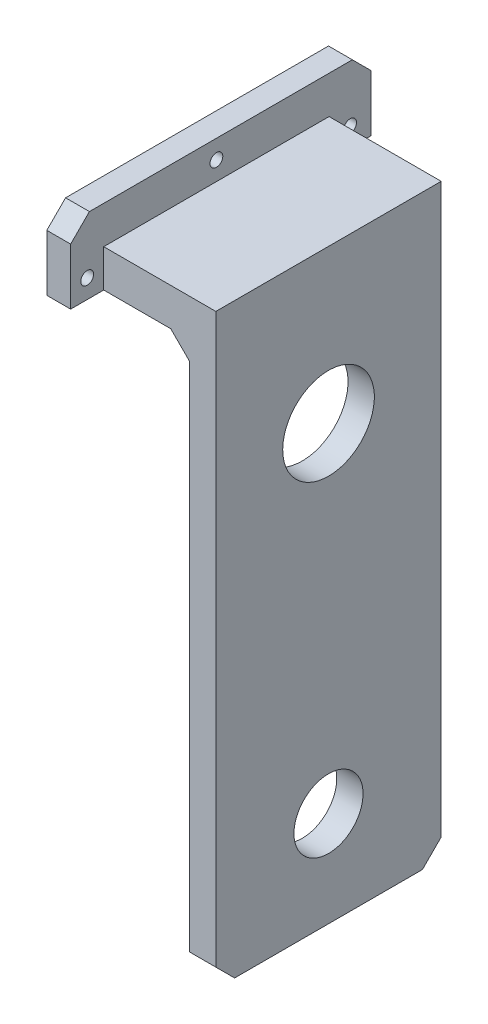
ISO-10303-21;
HEADER;
FILE_DESCRIPTION(('STEP AP214'),'2;1');
FILE_NAME('part.step','',(''),(''),'','','');
FILE_SCHEMA(('AUTOMOTIVE_DESIGN { 1 0 10303 214 1 1 1 1 }'));
ENDSEC;
DATA;
#1=APPLICATION_CONTEXT('core data for automotive mechanical design processes');
#2=APPLICATION_PROTOCOL_DEFINITION('international standard','automotive_design',2000,#1);
#3=PRODUCT_CONTEXT('',#1,'mechanical');
#4=PRODUCT('Part','Part','',(#3));
#5=PRODUCT_RELATED_PRODUCT_CATEGORY('part','',(#4));
#6=PRODUCT_DEFINITION_FORMATION('','',#4);
#7=PRODUCT_DEFINITION_CONTEXT('part definition',#1,'design');
#8=PRODUCT_DEFINITION('design','',#6,#7);
#9=PRODUCT_DEFINITION_SHAPE('','',#8);
#10=(LENGTH_UNIT() NAMED_UNIT(*) SI_UNIT(.MILLI.,.METRE.));
#11=(NAMED_UNIT(*) PLANE_ANGLE_UNIT() SI_UNIT($,.RADIAN.));
#12=(NAMED_UNIT(*) SI_UNIT($,.STERADIAN.) SOLID_ANGLE_UNIT());
#13=UNCERTAINTY_MEASURE_WITH_UNIT(LENGTH_MEASURE(1.E-05),#10,'distance_accuracy_value','');
#14=(GEOMETRIC_REPRESENTATION_CONTEXT(3) GLOBAL_UNCERTAINTY_ASSIGNED_CONTEXT((#13)) GLOBAL_UNIT_ASSIGNED_CONTEXT((#10,
#11,#12)) REPRESENTATION_CONTEXT('',''));
#15=CARTESIAN_POINT('',(0.,0.,0.));
#16=DIRECTION('',(0.,0.,1.));
#17=DIRECTION('',(1.,0.,0.));
#18=AXIS2_PLACEMENT_3D('',#15,#16,#17);
#19=CARTESIAN_POINT('',(18.1,-2.5,-15.));
#20=DIRECTION('',(0.,1.,0.));
#21=DIRECTION('',(0.,0.,-1.));
#22=AXIS2_PLACEMENT_3D('',#19,#20,#21);
#23=PLANE('',#22);
#24=DIRECTION('',(-1.,0.,0.));
#25=VECTOR('',#24,1.);
#26=CARTESIAN_POINT('',(18.1,-2.5,15.));
#27=LINE('',#26,#25);
#28=CARTESIAN_POINT('',(12.1,-2.5,15.));
#29=VERTEX_POINT('',#28);
#30=CARTESIAN_POINT('',(3.175,-2.5,15.));
#31=VERTEX_POINT('',#30);
#32=EDGE_CURVE('E179',#29,#31,#27,.T.);
#33=ORIENTED_EDGE('',*,*,#32,.T.);
#34=DIRECTION('',(0.,0.,-1.));
#35=VECTOR('',#34,1.);
#36=CARTESIAN_POINT('',(3.175,-2.5,19.402609778092));
#37=LINE('',#36,#35);
#38=CARTESIAN_POINT('',(3.175,-2.5,19.402609778092));
#39=VERTEX_POINT('',#38);
#40=EDGE_CURVE('E157',#39,#31,#37,.T.);
#41=ORIENTED_EDGE('',*,*,#40,.F.);
#42=DIRECTION('',(-1.,0.,0.));
#43=VECTOR('',#42,1.);
#44=CARTESIAN_POINT('',(3.175,-2.5,19.402609778092));
#45=LINE('',#44,#43);
#46=CARTESIAN_POINT('',(0.,-2.5,19.402609778092));
#47=VERTEX_POINT('',#46);
#48=EDGE_CURVE('E167',#39,#47,#45,.T.);
#49=ORIENTED_EDGE('',*,*,#48,.T.);
#50=DIRECTION('',(0.,0.,1.));
#51=VECTOR('',#50,1.);
#52=CARTESIAN_POINT('',(0.,-2.5,-15.));
#53=LINE('',#52,#51);
#54=CARTESIAN_POINT('',(0.,-2.5,-20.597390221908));
#55=VERTEX_POINT('',#54);
#56=EDGE_CURVE('E202',#55,#47,#53,.T.);
#57=ORIENTED_EDGE('',*,*,#56,.F.);
#58=DIRECTION('',(-1.,0.,0.));
#59=VECTOR('',#58,1.);
#60=CARTESIAN_POINT('',(3.175,-2.5,-20.597390221908));
#61=LINE('',#60,#59);
#62=CARTESIAN_POINT('',(3.175,-2.5,-20.597390221908));
#63=VERTEX_POINT('',#62);
#64=EDGE_CURVE('E174',#63,#55,#61,.T.);
#65=ORIENTED_EDGE('',*,*,#64,.F.);
#66=CARTESIAN_POINT('',(3.175,-2.5,-15.));
#67=VERTEX_POINT('',#66);
#68=EDGE_CURVE('E163',#67,#63,#37,.T.);
#69=ORIENTED_EDGE('',*,*,#68,.F.);
#70=DIRECTION('',(-1.,0.,0.));
#71=VECTOR('',#70,1.);
#72=CARTESIAN_POINT('',(18.1,-2.5,-15.));
#73=LINE('',#72,#71);
#74=CARTESIAN_POINT('',(12.1,-2.5,-15.));
#75=VERTEX_POINT('',#74);
#76=EDGE_CURVE('E219',#75,#67,#73,.T.);
#77=ORIENTED_EDGE('',*,*,#76,.F.);
#78=DIRECTION('',(0.,0.,-1.));
#79=VECTOR('',#78,1.);
#80=CARTESIAN_POINT('',(12.1,-2.5,-15.));
#81=LINE('',#80,#79);
#82=EDGE_CURVE('E226',#29,#75,#81,.T.);
#83=ORIENTED_EDGE('',*,*,#82,.F.);
#84=EDGE_LOOP('',(#33,#41,#49,#57,#65,#69,#77,#83));
#85=FACE_BOUND('',#84,.T.);
#86=ADVANCED_FACE('F43',(#85),#23,.F.);
#87=CARTESIAN_POINT('',(18.1,2.5,-15.));
#88=DIRECTION('',(0.,0.,1.));
#89=DIRECTION('',(-1.,0.,0.));
#90=AXIS2_PLACEMENT_3D('',#87,#88,#89);
#91=PLANE('',#90);
#92=DIRECTION('',(0.,1.,0.));
#93=VECTOR('',#92,1.);
#94=CARTESIAN_POINT('',(14.6,-75.6,-15.));
#95=LINE('',#94,#93);
#96=CARTESIAN_POINT('',(14.6,-73.1,-15.));
#97=VERTEX_POINT('',#96);
#98=CARTESIAN_POINT('',(14.6,-5.,-15.));
#99=VERTEX_POINT('',#98);
#100=EDGE_CURVE('E276',#97,#99,#95,.T.);
#101=ORIENTED_EDGE('',*,*,#100,.T.);
#102=DIRECTION('',(-0.707106781186545,0.70710678118655,0.));
#103=VECTOR('',#102,1.);
#104=CARTESIAN_POINT('',(12.6,-2.99999999999998,-15.));
#105=LINE('',#104,#103);
#106=EDGE_CURVE('E231',#75,#99,#105,.F.);
#107=ORIENTED_EDGE('',*,*,#106,.F.);
#108=ORIENTED_EDGE('',*,*,#76,.T.);
#109=DIRECTION('',(0.,1.,0.));
#110=VECTOR('',#109,1.);
#111=CARTESIAN_POINT('',(3.175,2.5,-15.));
#112=LINE('',#111,#110);
#113=CARTESIAN_POINT('',(3.175,2.5,-15.));
#114=VERTEX_POINT('',#113);
#115=EDGE_CURVE('E199',#67,#114,#112,.T.);
#116=ORIENTED_EDGE('',*,*,#115,.T.);
#117=DIRECTION('',(-1.,0.,0.));
#118=VECTOR('',#117,1.);
#119=CARTESIAN_POINT('',(18.1,2.5,-15.));
#120=LINE('',#119,#118);
#121=CARTESIAN_POINT('',(18.1,2.5,-15.));
#122=VERTEX_POINT('',#121);
#123=EDGE_CURVE('E211',#122,#114,#120,.T.);
#124=ORIENTED_EDGE('',*,*,#123,.F.);
#125=DIRECTION('',(0.,-1.,0.));
#126=VECTOR('',#125,1.);
#127=CARTESIAN_POINT('',(18.1,2.5,-15.));
#128=LINE('',#127,#126);
#129=CARTESIAN_POINT('',(18.1,-73.1,-15.));
#130=VERTEX_POINT('',#129);
#131=EDGE_CURVE('E203',#122,#130,#128,.T.);
#132=ORIENTED_EDGE('',*,*,#131,.T.);
#133=DIRECTION('',(1.,0.,0.));
#134=VECTOR('',#133,1.);
#135=CARTESIAN_POINT('',(18.1,-73.1,-15.));
#136=LINE('',#135,#134);
#137=EDGE_CURVE('E11',#97,#130,#136,.T.);
#138=ORIENTED_EDGE('',*,*,#137,.F.);
#139=EDGE_LOOP('',(#101,#107,#108,#116,#124,#132,#138));
#140=FACE_BOUND('',#139,.T.);
#141=ADVANCED_FACE('F323',(#140),#91,.F.);
#142=CARTESIAN_POINT('',(18.1,2.5,15.));
#143=DIRECTION('',(0.,0.,-1.));
#144=DIRECTION('',(1.,0.,0.));
#145=AXIS2_PLACEMENT_3D('',#142,#143,#144);
#146=PLANE('',#145);
#147=DIRECTION('',(0.,1.,0.));
#148=VECTOR('',#147,1.);
#149=CARTESIAN_POINT('',(18.1,2.5,15.));
#150=LINE('',#149,#148);
#151=CARTESIAN_POINT('',(18.1,-73.1,15.));
#152=VERTEX_POINT('',#151);
#153=CARTESIAN_POINT('',(18.1,2.5,15.));
#154=VERTEX_POINT('',#153);
#155=EDGE_CURVE('E206',#152,#154,#150,.T.);
#156=ORIENTED_EDGE('',*,*,#155,.T.);
#157=DIRECTION('',(-1.,0.,0.));
#158=VECTOR('',#157,1.);
#159=CARTESIAN_POINT('',(18.1,2.5,15.));
#160=LINE('',#159,#158);
#161=CARTESIAN_POINT('',(3.175,2.5,15.));
#162=VERTEX_POINT('',#161);
#163=EDGE_CURVE('E215',#154,#162,#160,.T.);
#164=ORIENTED_EDGE('',*,*,#163,.T.);
#165=DIRECTION('',(0.,-1.,0.));
#166=VECTOR('',#165,1.);
#167=CARTESIAN_POINT('',(3.175,2.5,15.));
#168=LINE('',#167,#166);
#169=EDGE_CURVE('E196',#162,#31,#168,.T.);
#170=ORIENTED_EDGE('',*,*,#169,.T.);
#171=ORIENTED_EDGE('',*,*,#32,.F.);
#172=DIRECTION('',(0.707106781186545,-0.70710678118655,0.));
#173=VECTOR('',#172,1.);
#174=CARTESIAN_POINT('',(12.6,-2.99999999999998,15.));
#175=LINE('',#174,#173);
#176=CARTESIAN_POINT('',(14.6,-5.,15.));
#177=VERTEX_POINT('',#176);
#178=EDGE_CURVE('E229',#177,#29,#175,.F.);
#179=ORIENTED_EDGE('',*,*,#178,.F.);
#180=DIRECTION('',(0.,1.,0.));
#181=VECTOR('',#180,1.);
#182=CARTESIAN_POINT('',(14.6,-75.6,15.));
#183=LINE('',#182,#181);
#184=CARTESIAN_POINT('',(14.6,-73.1,15.));
#185=VERTEX_POINT('',#184);
#186=EDGE_CURVE('E273',#185,#177,#183,.T.);
#187=ORIENTED_EDGE('',*,*,#186,.F.);
#188=DIRECTION('',(-1.,0.,0.));
#189=VECTOR('',#188,1.);
#190=CARTESIAN_POINT('',(18.1,-73.1,15.));
#191=LINE('',#190,#189);
#192=EDGE_CURVE('E261',#152,#185,#191,.T.);
#193=ORIENTED_EDGE('',*,*,#192,.F.);
#194=EDGE_LOOP('',(#156,#164,#170,#171,#179,#187,#193));
#195=FACE_BOUND('',#194,.T.);
#196=ADVANCED_FACE('F328',(#195),#146,.F.);
#197=CARTESIAN_POINT('',(18.1,2.5,-15.));
#198=DIRECTION('',(0.,-1.,0.));
#199=DIRECTION('',(0.,0.,1.));
#200=AXIS2_PLACEMENT_3D('',#197,#198,#199);
#201=PLANE('',#200);
#202=DIRECTION('',(0.,0.,1.));
#203=VECTOR('',#202,1.);
#204=CARTESIAN_POINT('',(3.175,2.5,-15.));
#205=LINE('',#204,#203);
#206=EDGE_CURVE('E222',#114,#162,#205,.T.);
#207=ORIENTED_EDGE('',*,*,#206,.T.);
#208=ORIENTED_EDGE('',*,*,#163,.F.);
#209=DIRECTION('',(0.,0.,-1.));
#210=VECTOR('',#209,1.);
#211=CARTESIAN_POINT('',(18.1,2.5,-15.));
#212=LINE('',#211,#210);
#213=EDGE_CURVE('E209',#154,#122,#212,.T.);
#214=ORIENTED_EDGE('',*,*,#213,.T.);
#215=ORIENTED_EDGE('',*,*,#123,.T.);
#216=EDGE_LOOP('',(#207,#208,#214,#215));
#217=FACE_BOUND('',#216,.T.);
#218=ADVANCED_FACE('F385',(#217),#201,.F.);
#219=CARTESIAN_POINT('',(18.1,0.,0.));
#220=DIRECTION('',(1.,0.,0.));
#221=DIRECTION('',(0.,0.,1.));
#222=AXIS2_PLACEMENT_3D('',#219,#220,#221);
#223=PLANE('',#222);
#224=CARTESIAN_POINT('',(18.1,-17.9000000000868,2.03531101694576E-06));
#225=DIRECTION('',(-1.,0.,0.));
#226=DIRECTION('',(0.,0.,1.));
#227=AXIS2_PLACEMENT_3D('',#224,#225,#226);
#228=CIRCLE('',#227,6.1);
#229=CARTESIAN_POINT('',(18.1,-17.9000000000868,6.10000203531102));
#230=VERTEX_POINT('',#229);
#231=EDGE_CURVE('E549',#230,#230,#228,.T.);
#232=ORIENTED_EDGE('',*,*,#231,.T.);
#233=EDGE_LOOP('',(#232));
#234=FACE_BOUND('',#233,.T.);
#235=CARTESIAN_POINT('',(18.1,-62.9000000000129,5.14422879294152E-09));
#236=DIRECTION('',(-1.,0.,0.));
#237=DIRECTION('',(0.,0.,1.));
#238=AXIS2_PLACEMENT_3D('',#235,#236,#237);
#239=CIRCLE('',#238,4.6);
#240=CARTESIAN_POINT('',(18.1,-62.9000000000129,4.60000000514423));
#241=VERTEX_POINT('',#240);
#242=EDGE_CURVE('E552',#241,#241,#239,.T.);
#243=ORIENTED_EDGE('',*,*,#242,.T.);
#244=EDGE_LOOP('',(#243));
#245=FACE_BOUND('',#244,.T.);
#246=DIRECTION('',(0.,0.,-1.));
#247=VECTOR('',#246,1.);
#248=CARTESIAN_POINT('',(18.1,-75.6,-15.));
#249=LINE('',#248,#247);
#250=CARTESIAN_POINT('',(18.1,-75.6,12.5));
#251=VERTEX_POINT('',#250);
#252=CARTESIAN_POINT('',(18.1,-75.6,-12.5));
#253=VERTEX_POINT('',#252);
#254=EDGE_CURVE('E274',#251,#253,#249,.T.);
#255=ORIENTED_EDGE('',*,*,#254,.T.);
#256=DIRECTION('',(0.,0.707106781186548,-0.707106781186548));
#257=VECTOR('',#256,1.);
#258=CARTESIAN_POINT('',(18.1,-44.05,-44.05));
#259=LINE('',#258,#257);
#260=EDGE_CURVE('E256',#130,#253,#259,.F.);
#261=ORIENTED_EDGE('',*,*,#260,.F.);
#262=ORIENTED_EDGE('',*,*,#131,.F.);
#263=ORIENTED_EDGE('',*,*,#213,.F.);
#264=ORIENTED_EDGE('',*,*,#155,.F.);
#265=DIRECTION('',(0.,-0.707106781186548,-0.707106781186548));
#266=VECTOR('',#265,1.);
#267=CARTESIAN_POINT('',(18.1,-44.05,44.05));
#268=LINE('',#267,#266);
#269=EDGE_CURVE('E259',#251,#152,#268,.F.);
#270=ORIENTED_EDGE('',*,*,#269,.F.);
#271=EDGE_LOOP('',(#255,#261,#262,#263,#264,#270));
#272=FACE_BOUND('',#271,.T.);
#273=ADVANCED_FACE('F377',(#234,#245,#272),#223,.T.);
#274=CARTESIAN_POINT('',(0.,0.,0.));
#275=DIRECTION('',(1.,0.,0.));
#276=DIRECTION('',(0.,0.,1.));
#277=AXIS2_PLACEMENT_3D('',#274,#275,#276);
#278=PLANE('',#277);
#279=DIRECTION('',(0.,0.,1.));
#280=VECTOR('',#279,1.);
#281=CARTESIAN_POINT('',(0.,7.5,19.402609778092));
#282=LINE('',#281,#280);
#283=CARTESIAN_POINT('',(0.,7.5,-18.097390221908));
#284=VERTEX_POINT('',#283);
#285=CARTESIAN_POINT('',(0.,7.5,16.902609778092));
#286=VERTEX_POINT('',#285);
#287=EDGE_CURVE('E164',#284,#286,#282,.T.);
#288=ORIENTED_EDGE('',*,*,#287,.F.);
#289=DIRECTION('',(0.,-0.707106781186548,-0.707106781186548));
#290=VECTOR('',#289,1.);
#291=CARTESIAN_POINT('',(0.,5.00000000000001,-20.597390221908));
#292=LINE('',#291,#290);
#293=CARTESIAN_POINT('',(0.,5.00000000000001,-20.597390221908));
#294=VERTEX_POINT('',#293);
#295=EDGE_CURVE('E238',#294,#284,#292,.F.);
#296=ORIENTED_EDGE('',*,*,#295,.F.);
#297=DIRECTION('',(0.,1.,0.));
#298=VECTOR('',#297,1.);
#299=CARTESIAN_POINT('',(0.,-2.5,-20.597390221908));
#300=LINE('',#299,#298);
#301=EDGE_CURVE('E189',#55,#294,#300,.T.);
#302=ORIENTED_EDGE('',*,*,#301,.F.);
#303=ORIENTED_EDGE('',*,*,#56,.T.);
#304=DIRECTION('',(0.,-1.,0.));
#305=VECTOR('',#304,1.);
#306=CARTESIAN_POINT('',(0.,7.5,19.402609778092));
#307=LINE('',#306,#305);
#308=CARTESIAN_POINT('',(0.,4.99999999999998,19.402609778092));
#309=VERTEX_POINT('',#308);
#310=EDGE_CURVE('E170',#309,#47,#307,.T.);
#311=ORIENTED_EDGE('',*,*,#310,.F.);
#312=DIRECTION('',(0.,0.707106781186549,-0.707106781186546));
#313=VECTOR('',#312,1.);
#314=CARTESIAN_POINT('',(0.,7.5,16.902609778092));
#315=LINE('',#314,#313);
#316=EDGE_CURVE('E241',#286,#309,#315,.F.);
#317=ORIENTED_EDGE('',*,*,#316,.F.);
#318=EDGE_LOOP('',(#288,#296,#302,#303,#311,#317));
#319=FACE_BOUND('',#318,.T.);
#320=CARTESIAN_POINT('',(0.,5.,0.));
#321=DIRECTION('',(1.,0.,0.));
#322=DIRECTION('',(0.,0.,-1.));
#323=AXIS2_PLACEMENT_3D('',#320,#321,#322);
#324=CIRCLE('',#323,0.85);
#325=CARTESIAN_POINT('',(0.,5.,-0.85));
#326=VERTEX_POINT('',#325);
#327=EDGE_CURVE('E295',#326,#326,#324,.T.);
#328=ORIENTED_EDGE('',*,*,#327,.T.);
#329=EDGE_LOOP('',(#328));
#330=FACE_BOUND('',#329,.T.);
#331=CARTESIAN_POINT('',(0.,0.,17.201304889046));
#332=DIRECTION('',(1.,0.,0.));
#333=DIRECTION('',(0.,0.,-1.));
#334=AXIS2_PLACEMENT_3D('',#331,#332,#333);
#335=CIRCLE('',#334,0.85);
#336=CARTESIAN_POINT('',(0.,0.,16.351304889046));
#337=VERTEX_POINT('',#336);
#338=EDGE_CURVE('E289',#337,#337,#335,.T.);
#339=ORIENTED_EDGE('',*,*,#338,.T.);
#340=EDGE_LOOP('',(#339));
#341=FACE_BOUND('',#340,.T.);
#342=CARTESIAN_POINT('',(0.,0.,-17.798695110954));
#343=DIRECTION('',(1.,0.,0.));
#344=DIRECTION('',(0.,0.,-1.));
#345=AXIS2_PLACEMENT_3D('',#342,#343,#344);
#346=CIRCLE('',#345,0.85);
#347=CARTESIAN_POINT('',(0.,0.,-18.648695110954));
#348=VERTEX_POINT('',#347);
#349=EDGE_CURVE('E285',#348,#348,#346,.T.);
#350=ORIENTED_EDGE('',*,*,#349,.T.);
#351=EDGE_LOOP('',(#350));
#352=FACE_BOUND('',#351,.T.);
#353=ADVANCED_FACE('F302',(#319,#330,#341,#352),#278,.F.);
#354=CARTESIAN_POINT('',(3.175,0.,0.));
#355=DIRECTION('',(-1.,0.,0.));
#356=DIRECTION('',(0.,0.,-1.));
#357=AXIS2_PLACEMENT_3D('',#354,#355,#356);
#358=PLANE('',#357);
#359=CARTESIAN_POINT('',(3.175,0.,-17.798695110954));
#360=DIRECTION('',(1.,0.,0.));
#361=DIRECTION('',(0.,0.,-1.));
#362=AXIS2_PLACEMENT_3D('',#359,#360,#361);
#363=CIRCLE('',#362,0.85);
#364=CARTESIAN_POINT('',(3.175,0.,-18.648695110954));
#365=VERTEX_POINT('',#364);
#366=EDGE_CURVE('E286',#365,#365,#363,.T.);
#367=ORIENTED_EDGE('',*,*,#366,.F.);
#368=EDGE_LOOP('',(#367));
#369=FACE_BOUND('',#368,.T.);
#370=CARTESIAN_POINT('',(3.175,0.,17.201304889046));
#371=DIRECTION('',(1.,0.,0.));
#372=DIRECTION('',(0.,0.,-1.));
#373=AXIS2_PLACEMENT_3D('',#370,#371,#372);
#374=CIRCLE('',#373,0.85);
#375=CARTESIAN_POINT('',(3.175,0.,16.351304889046));
#376=VERTEX_POINT('',#375);
#377=EDGE_CURVE('E292',#376,#376,#374,.T.);
#378=ORIENTED_EDGE('',*,*,#377,.F.);
#379=EDGE_LOOP('',(#378));
#380=FACE_BOUND('',#379,.T.);
#381=CARTESIAN_POINT('',(3.175,5.,0.));
#382=DIRECTION('',(1.,0.,0.));
#383=DIRECTION('',(0.,0.,-1.));
#384=AXIS2_PLACEMENT_3D('',#381,#382,#383);
#385=CIRCLE('',#384,0.85);
#386=CARTESIAN_POINT('',(3.175,5.,-0.85));
#387=VERTEX_POINT('',#386);
#388=EDGE_CURVE('E190',#387,#387,#385,.T.);
#389=ORIENTED_EDGE('',*,*,#388,.F.);
#390=EDGE_LOOP('',(#389));
#391=FACE_BOUND('',#390,.T.);
#392=DIRECTION('',(0.,-1.,0.));
#393=VECTOR('',#392,1.);
#394=CARTESIAN_POINT('',(3.175,7.5,19.402609778092));
#395=LINE('',#394,#393);
#396=CARTESIAN_POINT('',(3.175,4.99999999999998,19.402609778092));
#397=VERTEX_POINT('',#396);
#398=EDGE_CURVE('E152',#397,#39,#395,.T.);
#399=ORIENTED_EDGE('',*,*,#398,.T.);
#400=ORIENTED_EDGE('',*,*,#40,.T.);
#401=ORIENTED_EDGE('',*,*,#169,.F.);
#402=ORIENTED_EDGE('',*,*,#206,.F.);
#403=ORIENTED_EDGE('',*,*,#115,.F.);
#404=ORIENTED_EDGE('',*,*,#68,.T.);
#405=DIRECTION('',(0.,1.,0.));
#406=VECTOR('',#405,1.);
#407=CARTESIAN_POINT('',(3.175,-2.5,-20.597390221908));
#408=LINE('',#407,#406);
#409=CARTESIAN_POINT('',(3.175,5.00000000000001,-20.597390221908));
#410=VERTEX_POINT('',#409);
#411=EDGE_CURVE('E180',#63,#410,#408,.T.);
#412=ORIENTED_EDGE('',*,*,#411,.T.);
#413=DIRECTION('',(0.,0.707106781186548,0.707106781186548));
#414=VECTOR('',#413,1.);
#415=CARTESIAN_POINT('',(3.175,5.00000000000001,-20.597390221908));
#416=LINE('',#415,#414);
#417=CARTESIAN_POINT('',(3.175,7.5,-18.097390221908));
#418=VERTEX_POINT('',#417);
#419=EDGE_CURVE('E246',#418,#410,#416,.F.);
#420=ORIENTED_EDGE('',*,*,#419,.F.);
#421=DIRECTION('',(0.,0.,1.));
#422=VECTOR('',#421,1.);
#423=CARTESIAN_POINT('',(3.175,7.5,19.402609778092));
#424=LINE('',#423,#422);
#425=CARTESIAN_POINT('',(3.175,7.5,16.902609778092));
#426=VERTEX_POINT('',#425);
#427=EDGE_CURVE('E175',#418,#426,#424,.T.);
#428=ORIENTED_EDGE('',*,*,#427,.T.);
#429=DIRECTION('',(0.,-0.707106781186549,0.707106781186546));
#430=VECTOR('',#429,1.);
#431=CARTESIAN_POINT('',(3.175,7.5,16.902609778092));
#432=LINE('',#431,#430);
#433=EDGE_CURVE('E161',#397,#426,#432,.F.);
#434=ORIENTED_EDGE('',*,*,#433,.F.);
#435=EDGE_LOOP('',(#399,#400,#401,#402,#403,#404,#412,#420,#428,#434));
#436=FACE_BOUND('',#435,.T.);
#437=ADVANCED_FACE('F154',(#369,#380,#391,#436),#358,.F.);
#438=CARTESIAN_POINT('',(3.175,7.5,19.402609778092));
#439=DIRECTION('',(0.,0.,1.));
#440=DIRECTION('',(-1.,0.,0.));
#441=AXIS2_PLACEMENT_3D('',#438,#439,#440);
#442=PLANE('',#441);
#443=ORIENTED_EDGE('',*,*,#310,.T.);
#444=ORIENTED_EDGE('',*,*,#48,.F.);
#445=ORIENTED_EDGE('',*,*,#398,.F.);
#446=DIRECTION('',(1.,0.,0.));
#447=VECTOR('',#446,1.);
#448=CARTESIAN_POINT('',(3.175,4.99999999999998,19.402609778092));
#449=LINE('',#448,#447);
#450=EDGE_CURVE('E244',#309,#397,#449,.T.);
#451=ORIENTED_EDGE('',*,*,#450,.F.);
#452=EDGE_LOOP('',(#443,#444,#445,#451));
#453=FACE_BOUND('',#452,.T.);
#454=ADVANCED_FACE('F168',(#453),#442,.T.);
#455=CARTESIAN_POINT('',(3.175,7.5,19.402609778092));
#456=DIRECTION('',(0.,1.,0.));
#457=DIRECTION('',(0.,0.,-1.));
#458=AXIS2_PLACEMENT_3D('',#455,#456,#457);
#459=PLANE('',#458);
#460=ORIENTED_EDGE('',*,*,#427,.F.);
#461=DIRECTION('',(1.,0.,0.));
#462=VECTOR('',#461,1.);
#463=CARTESIAN_POINT('',(3.175,7.5,-18.097390221908));
#464=LINE('',#463,#462);
#465=EDGE_CURVE('E234',#284,#418,#464,.T.);
#466=ORIENTED_EDGE('',*,*,#465,.F.);
#467=ORIENTED_EDGE('',*,*,#287,.T.);
#468=DIRECTION('',(-1.,0.,0.));
#469=VECTOR('',#468,1.);
#470=CARTESIAN_POINT('',(3.175,7.5,16.902609778092));
#471=LINE('',#470,#469);
#472=EDGE_CURVE('E236',#426,#286,#471,.T.);
#473=ORIENTED_EDGE('',*,*,#472,.F.);
#474=EDGE_LOOP('',(#460,#466,#467,#473));
#475=FACE_BOUND('',#474,.T.);
#476=ADVANCED_FACE('F318',(#475),#459,.T.);
#477=CARTESIAN_POINT('',(3.175,-2.5,-20.597390221908));
#478=DIRECTION('',(0.,0.,-1.));
#479=DIRECTION('',(1.,0.,0.));
#480=AXIS2_PLACEMENT_3D('',#477,#478,#479);
#481=PLANE('',#480);
#482=ORIENTED_EDGE('',*,*,#411,.F.);
#483=ORIENTED_EDGE('',*,*,#64,.T.);
#484=ORIENTED_EDGE('',*,*,#301,.T.);
#485=DIRECTION('',(-1.,0.,0.));
#486=VECTOR('',#485,1.);
#487=CARTESIAN_POINT('',(3.175,5.00000000000001,-20.597390221908));
#488=LINE('',#487,#486);
#489=EDGE_CURVE('E250',#410,#294,#488,.T.);
#490=ORIENTED_EDGE('',*,*,#489,.F.);
#491=EDGE_LOOP('',(#482,#483,#484,#490));
#492=FACE_BOUND('',#491,.T.);
#493=ADVANCED_FACE('F308',(#492),#481,.T.);
#494=CARTESIAN_POINT('',(3.175,5.,0.));
#495=DIRECTION('',(-1.,0.,0.));
#496=DIRECTION('',(0.,0.,-1.));
#497=AXIS2_PLACEMENT_3D('',#494,#495,#496);
#498=CYLINDRICAL_SURFACE('',#497,0.85);
#499=ORIENTED_EDGE('',*,*,#388,.T.);
#500=EDGE_LOOP('',(#499));
#501=FACE_BOUND('',#500,.T.);
#502=ORIENTED_EDGE('',*,*,#327,.F.);
#503=EDGE_LOOP('',(#502));
#504=FACE_BOUND('',#503,.T.);
#505=ADVANCED_FACE('F305',(#501,#504),#498,.F.);
#506=CARTESIAN_POINT('',(3.175,0.,17.201304889046));
#507=DIRECTION('',(-1.,0.,0.));
#508=DIRECTION('',(0.,0.,-1.));
#509=AXIS2_PLACEMENT_3D('',#506,#507,#508);
#510=CYLINDRICAL_SURFACE('',#509,0.85);
#511=ORIENTED_EDGE('',*,*,#377,.T.);
#512=EDGE_LOOP('',(#511));
#513=FACE_BOUND('',#512,.T.);
#514=ORIENTED_EDGE('',*,*,#338,.F.);
#515=EDGE_LOOP('',(#514));
#516=FACE_BOUND('',#515,.T.);
#517=ADVANCED_FACE('F307',(#513,#516),#510,.F.);
#518=CARTESIAN_POINT('',(3.175,0.,-17.798695110954));
#519=DIRECTION('',(-1.,0.,0.));
#520=DIRECTION('',(0.,0.,-1.));
#521=AXIS2_PLACEMENT_3D('',#518,#519,#520);
#522=CYLINDRICAL_SURFACE('',#521,0.85);
#523=ORIENTED_EDGE('',*,*,#366,.T.);
#524=EDGE_LOOP('',(#523));
#525=FACE_BOUND('',#524,.T.);
#526=ORIENTED_EDGE('',*,*,#349,.F.);
#527=EDGE_LOOP('',(#526));
#528=FACE_BOUND('',#527,.T.);
#529=ADVANCED_FACE('F315',(#525,#528),#522,.F.);
#530=CARTESIAN_POINT('',(14.6,-75.6,-15.));
#531=DIRECTION('',(1.,0.,0.));
#532=DIRECTION('',(0.,0.,1.));
#533=AXIS2_PLACEMENT_3D('',#530,#531,#532);
#534=PLANE('',#533);
#535=CARTESIAN_POINT('',(14.6,-17.9000000000868,2.03531101694576E-06));
#536=DIRECTION('',(-1.,0.,0.));
#537=DIRECTION('',(0.,0.,1.));
#538=AXIS2_PLACEMENT_3D('',#535,#536,#537);
#539=CIRCLE('',#538,6.1);
#540=CARTESIAN_POINT('',(14.6,-17.9000000000868,6.10000203531102));
#541=VERTEX_POINT('',#540);
#542=EDGE_CURVE('E279',#541,#541,#539,.F.);
#543=ORIENTED_EDGE('',*,*,#542,.T.);
#544=EDGE_LOOP('',(#543));
#545=FACE_BOUND('',#544,.T.);
#546=CARTESIAN_POINT('',(14.6,-62.9000000000129,5.14422879294152E-09));
#547=DIRECTION('',(-1.,0.,0.));
#548=DIRECTION('',(0.,0.,1.));
#549=AXIS2_PLACEMENT_3D('',#546,#547,#548);
#550=CIRCLE('',#549,4.6);
#551=CARTESIAN_POINT('',(14.6,-62.9000000000129,4.60000000514423));
#552=VERTEX_POINT('',#551);
#553=EDGE_CURVE('E553',#552,#552,#550,.F.);
#554=ORIENTED_EDGE('',*,*,#553,.T.);
#555=EDGE_LOOP('',(#554));
#556=FACE_BOUND('',#555,.T.);
#557=ORIENTED_EDGE('',*,*,#186,.T.);
#558=DIRECTION('',(0.,0.,1.));
#559=VECTOR('',#558,1.);
#560=CARTESIAN_POINT('',(14.6,-5.,15.));
#561=LINE('',#560,#559);
#562=EDGE_CURVE('E224',#99,#177,#561,.T.);
#563=ORIENTED_EDGE('',*,*,#562,.F.);
#564=ORIENTED_EDGE('',*,*,#100,.F.);
#565=DIRECTION('',(0.,-0.707106781186548,0.707106781186548));
#566=VECTOR('',#565,1.);
#567=CARTESIAN_POINT('',(14.6,-75.6,-12.5));
#568=LINE('',#567,#566);
#569=CARTESIAN_POINT('',(14.6,-75.6,-12.5));
#570=VERTEX_POINT('',#569);
#571=EDGE_CURVE('E57',#570,#97,#568,.F.);
#572=ORIENTED_EDGE('',*,*,#571,.F.);
#573=DIRECTION('',(0.,0.,1.));
#574=VECTOR('',#573,1.);
#575=CARTESIAN_POINT('',(14.6,-75.6,-15.));
#576=LINE('',#575,#574);
#577=CARTESIAN_POINT('',(14.6,-75.6,12.5));
#578=VERTEX_POINT('',#577);
#579=EDGE_CURVE('E269',#570,#578,#576,.T.);
#580=ORIENTED_EDGE('',*,*,#579,.T.);
#581=DIRECTION('',(0.,0.707106781186548,0.707106781186548));
#582=VECTOR('',#581,1.);
#583=CARTESIAN_POINT('',(14.6,-75.6,12.5));
#584=LINE('',#583,#582);
#585=EDGE_CURVE('E51',#185,#578,#584,.F.);
#586=ORIENTED_EDGE('',*,*,#585,.F.);
#587=EDGE_LOOP('',(#557,#563,#564,#572,#580,#586));
#588=FACE_BOUND('',#587,.T.);
#589=ADVANCED_FACE('F270',(#545,#556,#588),#534,.F.);
#590=CARTESIAN_POINT('',(0.,-75.6,0.));
#591=DIRECTION('',(0.,1.,0.));
#592=DIRECTION('',(0.,0.,-1.));
#593=AXIS2_PLACEMENT_3D('',#590,#591,#592);
#594=PLANE('',#593);
#595=ORIENTED_EDGE('',*,*,#579,.F.);
#596=DIRECTION('',(-1.,0.,0.));
#597=VECTOR('',#596,1.);
#598=CARTESIAN_POINT('',(0.,-75.6,-12.5));
#599=LINE('',#598,#597);
#600=EDGE_CURVE('E252',#253,#570,#599,.T.);
#601=ORIENTED_EDGE('',*,*,#600,.F.);
#602=ORIENTED_EDGE('',*,*,#254,.F.);
#603=DIRECTION('',(1.,0.,0.));
#604=VECTOR('',#603,1.);
#605=CARTESIAN_POINT('',(0.,-75.6,12.5));
#606=LINE('',#605,#604);
#607=EDGE_CURVE('E254',#578,#251,#606,.T.);
#608=ORIENTED_EDGE('',*,*,#607,.F.);
#609=EDGE_LOOP('',(#595,#601,#602,#608));
#610=FACE_BOUND('',#609,.T.);
#611=ADVANCED_FACE('F338',(#610),#594,.F.);
#612=CARTESIAN_POINT('',(14.6,-5.,-15.));
#613=DIRECTION('',(-0.70710678118655,-0.707106781186545,0.));
#614=DIRECTION('',(0.,0.,-1.));
#615=AXIS2_PLACEMENT_3D('',#612,#613,#614);
#616=PLANE('',#615);
#617=ORIENTED_EDGE('',*,*,#106,.T.);
#618=ORIENTED_EDGE('',*,*,#562,.T.);
#619=ORIENTED_EDGE('',*,*,#178,.T.);
#620=ORIENTED_EDGE('',*,*,#82,.T.);
#621=EDGE_LOOP('',(#617,#618,#619,#620));
#622=FACE_BOUND('',#621,.T.);
#623=ADVANCED_FACE('F334',(#622),#616,.T.);
#624=CARTESIAN_POINT('',(3.175,7.5,16.902609778092));
#625=DIRECTION('',(0.,-0.707106781186545,-0.707106781186549));
#626=DIRECTION('',(-1.,0.,0.));
#627=AXIS2_PLACEMENT_3D('',#624,#625,#626);
#628=PLANE('',#627);
#629=ORIENTED_EDGE('',*,*,#433,.T.);
#630=ORIENTED_EDGE('',*,*,#472,.T.);
#631=ORIENTED_EDGE('',*,*,#316,.T.);
#632=ORIENTED_EDGE('',*,*,#450,.T.);
#633=EDGE_LOOP('',(#629,#630,#631,#632));
#634=FACE_BOUND('',#633,.T.);
#635=ADVANCED_FACE('F337',(#634),#628,.F.);
#636=CARTESIAN_POINT('',(3.175,5.00000000000001,-20.597390221908));
#637=DIRECTION('',(0.,-0.707106781186548,0.707106781186548));
#638=DIRECTION('',(-1.,0.,0.));
#639=AXIS2_PLACEMENT_3D('',#636,#637,#638);
#640=PLANE('',#639);
#641=ORIENTED_EDGE('',*,*,#419,.T.);
#642=ORIENTED_EDGE('',*,*,#489,.T.);
#643=ORIENTED_EDGE('',*,*,#295,.T.);
#644=ORIENTED_EDGE('',*,*,#465,.T.);
#645=EDGE_LOOP('',(#641,#642,#643,#644));
#646=FACE_BOUND('',#645,.T.);
#647=ADVANCED_FACE('F342',(#646),#640,.F.);
#648=CARTESIAN_POINT('',(-0.001000000000001,-62.9000000000129,5.14422879294152E-09));
#649=DIRECTION('',(1.,0.,0.));
#650=DIRECTION('',(0.,0.,1.));
#651=AXIS2_PLACEMENT_3D('',#648,#649,#650);
#652=CYLINDRICAL_SURFACE('',#651,4.6);
#653=ORIENTED_EDGE('',*,*,#242,.F.);
#654=EDGE_LOOP('',(#653));
#655=FACE_BOUND('',#654,.T.);
#656=ORIENTED_EDGE('',*,*,#553,.F.);
#657=EDGE_LOOP('',(#656));
#658=FACE_BOUND('',#657,.T.);
#659=ADVANCED_FACE('F345',(#655,#658),#652,.F.);
#660=CARTESIAN_POINT('',(-0.001000000000001,-17.9000000000868,2.03531101694576E-06));
#661=DIRECTION('',(1.,0.,0.));
#662=DIRECTION('',(0.,0.,1.));
#663=AXIS2_PLACEMENT_3D('',#660,#661,#662);
#664=CYLINDRICAL_SURFACE('',#663,6.1);
#665=ORIENTED_EDGE('',*,*,#231,.F.);
#666=EDGE_LOOP('',(#665));
#667=FACE_BOUND('',#666,.T.);
#668=ORIENTED_EDGE('',*,*,#542,.F.);
#669=EDGE_LOOP('',(#668));
#670=FACE_BOUND('',#669,.T.);
#671=ADVANCED_FACE('F348',(#667,#670),#664,.F.);
#672=CARTESIAN_POINT('',(0.,-75.6,12.5));
#673=DIRECTION('',(0.,0.707106781186547,-0.707106781186547));
#674=DIRECTION('',(1.,0.,0.));
#675=AXIS2_PLACEMENT_3D('',#672,#673,#674);
#676=PLANE('',#675);
#677=ORIENTED_EDGE('',*,*,#585,.T.);
#678=ORIENTED_EDGE('',*,*,#607,.T.);
#679=ORIENTED_EDGE('',*,*,#269,.T.);
#680=ORIENTED_EDGE('',*,*,#192,.T.);
#681=EDGE_LOOP('',(#677,#678,#679,#680));
#682=FACE_BOUND('',#681,.T.);
#683=ADVANCED_FACE('F264',(#682),#676,.F.);
#684=CARTESIAN_POINT('',(0.,-75.6,-12.5));
#685=DIRECTION('',(0.,0.707106781186547,0.707106781186547));
#686=DIRECTION('',(-1.,0.,0.));
#687=AXIS2_PLACEMENT_3D('',#684,#685,#686);
#688=PLANE('',#687);
#689=ORIENTED_EDGE('',*,*,#260,.T.);
#690=ORIENTED_EDGE('',*,*,#600,.T.);
#691=ORIENTED_EDGE('',*,*,#571,.T.);
#692=ORIENTED_EDGE('',*,*,#137,.T.);
#693=EDGE_LOOP('',(#689,#690,#691,#692));
#694=FACE_BOUND('',#693,.T.);
#695=ADVANCED_FACE('F45',(#694),#688,.F.);
#696=CLOSED_SHELL('',(#86,#141,#196,#218,#273,#353,#437,#454,#476,#493,#505,#517,#529,#589,#611,
#623,#635,#647,#659,#671,#683,#695));
#697=MANIFOLD_SOLID_BREP('B2',#696);
#698=ADVANCED_BREP_SHAPE_REPRESENTATION('',(#18,#697),#14);
#699=SHAPE_DEFINITION_REPRESENTATION(#9,#698);
ENDSEC;
END-ISO-10303-21;
